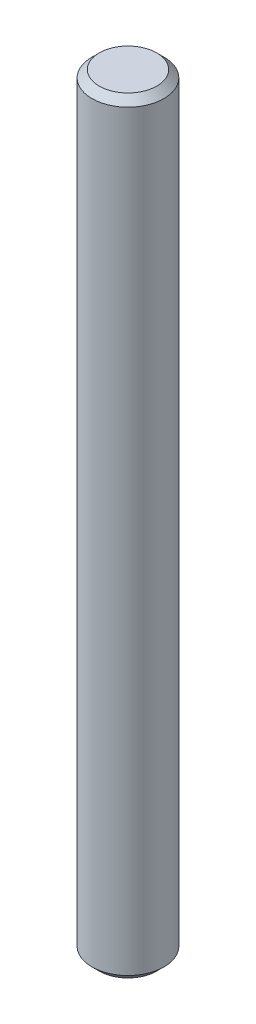
ISO-10303-21;
HEADER;
FILE_DESCRIPTION(('STEP AP214'),'2;1');
FILE_NAME('part.step','',(''),(''),'','','');
FILE_SCHEMA(('AUTOMOTIVE_DESIGN { 1 0 10303 214 1 1 1 1 }'));
ENDSEC;
DATA;
#1=APPLICATION_CONTEXT('core data for automotive mechanical design processes');
#2=APPLICATION_PROTOCOL_DEFINITION('international standard','automotive_design',2000,#1);
#3=PRODUCT_CONTEXT('',#1,'mechanical');
#4=PRODUCT('Part','Part','',(#3));
#5=PRODUCT_RELATED_PRODUCT_CATEGORY('part','',(#4));
#6=PRODUCT_DEFINITION_FORMATION('','',#4);
#7=PRODUCT_DEFINITION_CONTEXT('part definition',#1,'design');
#8=PRODUCT_DEFINITION('design','',#6,#7);
#9=PRODUCT_DEFINITION_SHAPE('','',#8);
#10=(LENGTH_UNIT() NAMED_UNIT(*) SI_UNIT(.MILLI.,.METRE.));
#11=(NAMED_UNIT(*) PLANE_ANGLE_UNIT() SI_UNIT($,.RADIAN.));
#12=(NAMED_UNIT(*) SI_UNIT($,.STERADIAN.) SOLID_ANGLE_UNIT());
#13=UNCERTAINTY_MEASURE_WITH_UNIT(LENGTH_MEASURE(1.E-05),#10,'distance_accuracy_value','');
#14=(GEOMETRIC_REPRESENTATION_CONTEXT(3) GLOBAL_UNCERTAINTY_ASSIGNED_CONTEXT((#13)) GLOBAL_UNIT_ASSIGNED_CONTEXT((#10,
#11,#12)) REPRESENTATION_CONTEXT('',''));
#15=CARTESIAN_POINT('',(0.,0.,0.));
#16=DIRECTION('',(0.,0.,1.));
#17=DIRECTION('',(1.,0.,0.));
#18=AXIS2_PLACEMENT_3D('',#15,#16,#17);
#19=CARTESIAN_POINT('',(0.,-0.65,0.));
#20=DIRECTION('',(0.,1.,0.));
#21=DIRECTION('',(0.,0.,1.));
#22=AXIS2_PLACEMENT_3D('',#19,#20,#21);
#23=CYLINDRICAL_SURFACE('',#22,0.5);
#24=CARTESIAN_POINT('',(0.,-0.550000000000002,0.));
#25=DIRECTION('',(0.,1.,0.));
#26=DIRECTION('',(0.,0.,1.));
#27=AXIS2_PLACEMENT_3D('',#24,#25,#26);
#28=CIRCLE('',#27,0.5);
#29=CARTESIAN_POINT('',(0.,-0.550000000000002,0.5));
#30=VERTEX_POINT('',#29);
#31=EDGE_CURVE('E42',#30,#30,#28,.T.);
#32=ORIENTED_EDGE('',*,*,#31,.T.);
#33=EDGE_LOOP('',(#32));
#34=FACE_BOUND('',#33,.T.);
#35=CARTESIAN_POINT('',(0.,9.9,0.));
#36=DIRECTION('',(0.,1.,0.));
#37=DIRECTION('',(0.,0.,1.));
#38=AXIS2_PLACEMENT_3D('',#35,#36,#37);
#39=CIRCLE('',#38,0.5);
#40=CARTESIAN_POINT('',(0.,9.9,0.5));
#41=VERTEX_POINT('',#40);
#42=EDGE_CURVE('E46',#41,#41,#39,.F.);
#43=ORIENTED_EDGE('',*,*,#42,.T.);
#44=EDGE_LOOP('',(#43));
#45=FACE_BOUND('',#44,.T.);
#46=ADVANCED_FACE('F31',(#34,#45),#23,.T.);
#47=CARTESIAN_POINT('',(0.,-0.65,0.));
#48=DIRECTION('',(0.,1.,0.));
#49=DIRECTION('',(0.,0.,1.));
#50=AXIS2_PLACEMENT_3D('',#47,#48,#49);
#51=PLANE('',#50);
#52=CARTESIAN_POINT('',(0.,-0.65,0.));
#53=DIRECTION('',(0.,1.,0.));
#54=DIRECTION('',(0.,0.,1.));
#55=AXIS2_PLACEMENT_3D('',#52,#53,#54);
#56=CIRCLE('',#55,0.400000000000003);
#57=CARTESIAN_POINT('',(0.,-0.65,0.400000000000003));
#58=VERTEX_POINT('',#57);
#59=EDGE_CURVE('E38',#58,#58,#56,.F.);
#60=ORIENTED_EDGE('',*,*,#59,.T.);
#61=EDGE_LOOP('',(#60));
#62=FACE_BOUND('',#61,.T.);
#63=ADVANCED_FACE('F62',(#62),#51,.F.);
#64=CARTESIAN_POINT('',(0.,10.,0.));
#65=DIRECTION('',(0.,1.,0.));
#66=DIRECTION('',(0.,0.,1.));
#67=AXIS2_PLACEMENT_3D('',#64,#65,#66);
#68=PLANE('',#67);
#69=CARTESIAN_POINT('',(0.,10.,0.));
#70=DIRECTION('',(0.,1.,0.));
#71=DIRECTION('',(0.,0.,1.));
#72=AXIS2_PLACEMENT_3D('',#69,#70,#71);
#73=CIRCLE('',#72,0.400000000000001);
#74=CARTESIAN_POINT('',(0.,10.,0.400000000000001));
#75=VERTEX_POINT('',#74);
#76=EDGE_CURVE('E10',#75,#75,#73,.T.);
#77=ORIENTED_EDGE('',*,*,#76,.T.);
#78=EDGE_LOOP('',(#77));
#79=FACE_BOUND('',#78,.T.);
#80=ADVANCED_FACE('F59',(#79),#68,.T.);
#81=CARTESIAN_POINT('',(0.,-0.550000000000002,0.));
#82=DIRECTION('',(0.,1.,0.));
#83=DIRECTION('',(0.,0.,1.));
#84=AXIS2_PLACEMENT_3D('',#81,#82,#83);
#85=CONICAL_SURFACE('',#84,0.5,0.785398163397447);
#86=ORIENTED_EDGE('',*,*,#59,.F.);
#87=EDGE_LOOP('',(#86));
#88=FACE_BOUND('',#87,.T.);
#89=ORIENTED_EDGE('',*,*,#31,.F.);
#90=EDGE_LOOP('',(#89));
#91=FACE_BOUND('',#90,.T.);
#92=ADVANCED_FACE('F55',(#88,#91),#85,.T.);
#93=CARTESIAN_POINT('',(0.,10.,0.));
#94=DIRECTION('',(0.,-1.,0.));
#95=DIRECTION('',(0.,0.,-1.));
#96=AXIS2_PLACEMENT_3D('',#93,#94,#95);
#97=CONICAL_SURFACE('',#96,0.400000000000001,0.785398163397446);
#98=ORIENTED_EDGE('',*,*,#42,.F.);
#99=EDGE_LOOP('',(#98));
#100=FACE_BOUND('',#99,.T.);
#101=ORIENTED_EDGE('',*,*,#76,.F.);
#102=EDGE_LOOP('',(#101));
#103=FACE_BOUND('',#102,.T.);
#104=ADVANCED_FACE('F33',(#100,#103),#97,.T.);
#105=CLOSED_SHELL('',(#46,#63,#80,#92,#104));
#106=MANIFOLD_SOLID_BREP('B2',#105);
#107=ADVANCED_BREP_SHAPE_REPRESENTATION('',(#18,#106),#14);
#108=SHAPE_DEFINITION_REPRESENTATION(#9,#107);
ENDSEC;
END-ISO-10303-21;
